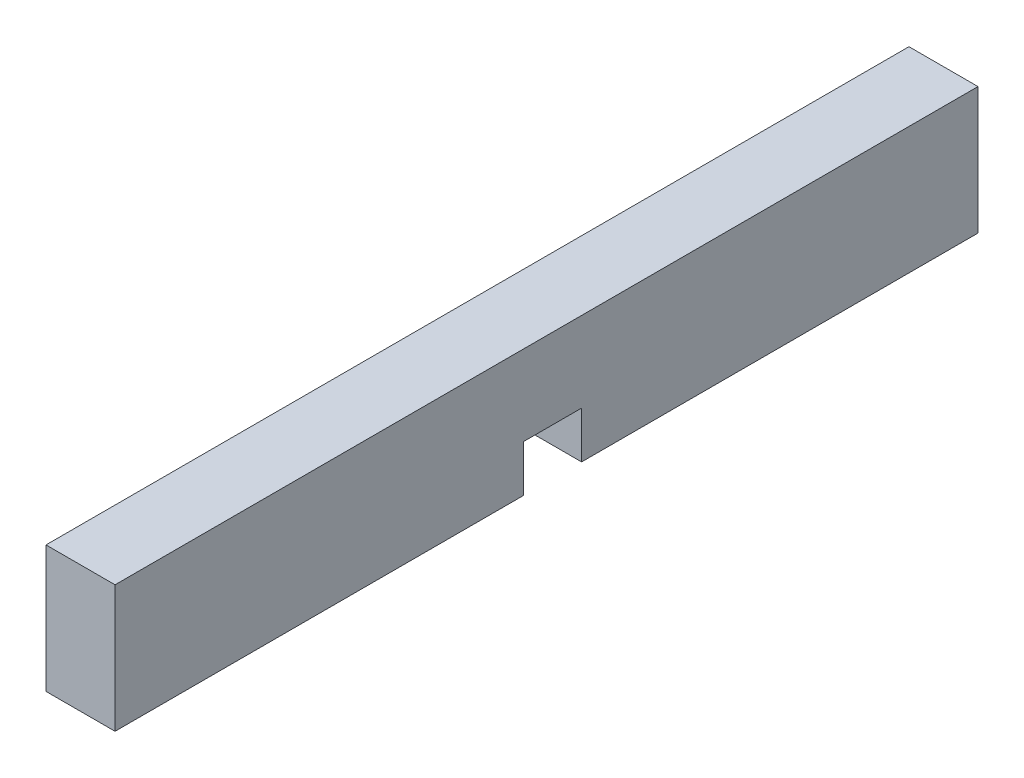
ISO-10303-21;
HEADER;
FILE_DESCRIPTION(('STEP AP214'),'2;1');
FILE_NAME('part.step','',(''),(''),'','','');
FILE_SCHEMA(('AUTOMOTIVE_DESIGN { 1 0 10303 214 1 1 1 1 }'));
ENDSEC;
DATA;
#1=APPLICATION_CONTEXT('core data for automotive mechanical design processes');
#2=APPLICATION_PROTOCOL_DEFINITION('international standard','automotive_design',2000,#1);
#3=PRODUCT_CONTEXT('',#1,'mechanical');
#4=PRODUCT('Part','Part','',(#3));
#5=PRODUCT_RELATED_PRODUCT_CATEGORY('part','',(#4));
#6=PRODUCT_DEFINITION_FORMATION('','',#4);
#7=PRODUCT_DEFINITION_CONTEXT('part definition',#1,'design');
#8=PRODUCT_DEFINITION('design','',#6,#7);
#9=PRODUCT_DEFINITION_SHAPE('','',#8);
#10=(LENGTH_UNIT() NAMED_UNIT(*) SI_UNIT(.MILLI.,.METRE.));
#11=(NAMED_UNIT(*) PLANE_ANGLE_UNIT() SI_UNIT($,.RADIAN.));
#12=(NAMED_UNIT(*) SI_UNIT($,.STERADIAN.) SOLID_ANGLE_UNIT());
#13=UNCERTAINTY_MEASURE_WITH_UNIT(LENGTH_MEASURE(1.E-05),#10,'distance_accuracy_value','');
#14=(GEOMETRIC_REPRESENTATION_CONTEXT(3) GLOBAL_UNCERTAINTY_ASSIGNED_CONTEXT((#13)) GLOBAL_UNIT_ASSIGNED_CONTEXT((#10,
#11,#12)) REPRESENTATION_CONTEXT('',''));
#15=CARTESIAN_POINT('',(0.,0.,0.));
#16=DIRECTION('',(0.,0.,1.));
#17=DIRECTION('',(1.,0.,0.));
#18=AXIS2_PLACEMENT_3D('',#15,#16,#17);
#19=CARTESIAN_POINT('',(2.3495,-4.318,29.3624));
#20=DIRECTION('',(0.,1.,0.));
#21=DIRECTION('',(0.,0.,1.));
#22=AXIS2_PLACEMENT_3D('',#19,#20,#21);
#23=PLANE('',#22);
#24=DIRECTION('',(0.,0.,-1.));
#25=VECTOR('',#24,1.);
#26=CARTESIAN_POINT('',(-2.3495,-4.318,29.3624));
#27=LINE('',#26,#25);
#28=CARTESIAN_POINT('',(-2.3495,-4.318,29.3624));
#29=VERTEX_POINT('',#28);
#30=CARTESIAN_POINT('',(-2.3495,-4.318,1.5748));
#31=VERTEX_POINT('',#30);
#32=EDGE_CURVE('E125',#29,#31,#27,.T.);
#33=ORIENTED_EDGE('',*,*,#32,.T.);
#34=DIRECTION('',(1.,0.,0.));
#35=VECTOR('',#34,1.);
#36=CARTESIAN_POINT('',(-2.3495,-4.318,1.5748));
#37=LINE('',#36,#35);
#38=CARTESIAN_POINT('',(2.3495,-4.318,1.5748));
#39=VERTEX_POINT('',#38);
#40=EDGE_CURVE('E108',#31,#39,#37,.T.);
#41=ORIENTED_EDGE('',*,*,#40,.T.);
#42=DIRECTION('',(0.,0.,-1.));
#43=VECTOR('',#42,1.);
#44=CARTESIAN_POINT('',(2.3495,-4.318,29.3624));
#45=LINE('',#44,#43);
#46=CARTESIAN_POINT('',(2.3495,-4.318,29.3624));
#47=VERTEX_POINT('',#46);
#48=EDGE_CURVE('E141',#47,#39,#45,.T.);
#49=ORIENTED_EDGE('',*,*,#48,.F.);
#50=DIRECTION('',(-1.,0.,0.));
#51=VECTOR('',#50,1.);
#52=CARTESIAN_POINT('',(2.3495,-4.318,29.3624));
#53=LINE('',#52,#51);
#54=EDGE_CURVE('E131',#47,#29,#53,.T.);
#55=ORIENTED_EDGE('',*,*,#54,.T.);
#56=EDGE_LOOP('',(#33,#41,#49,#55));
#57=FACE_BOUND('',#56,.T.);
#58=ADVANCED_FACE('F32',(#57),#23,.F.);
#59=CARTESIAN_POINT('',(2.3495,4.318,-29.3624));
#60=DIRECTION('',(0.,0.,1.));
#61=DIRECTION('',(1.,0.,0.));
#62=AXIS2_PLACEMENT_3D('',#59,#60,#61);
#63=PLANE('',#62);
#64=DIRECTION('',(0.,1.,0.));
#65=VECTOR('',#64,1.);
#66=CARTESIAN_POINT('',(-2.3495,4.318,-29.3624));
#67=LINE('',#66,#65);
#68=CARTESIAN_POINT('',(-2.3495,-4.318,-29.3624));
#69=VERTEX_POINT('',#68);
#70=CARTESIAN_POINT('',(-2.3495,4.318,-29.3624));
#71=VERTEX_POINT('',#70);
#72=EDGE_CURVE('E149',#69,#71,#67,.T.);
#73=ORIENTED_EDGE('',*,*,#72,.T.);
#74=DIRECTION('',(-1.,0.,0.));
#75=VECTOR('',#74,1.);
#76=CARTESIAN_POINT('',(2.3495,4.318,-29.3624));
#77=LINE('',#76,#75);
#78=CARTESIAN_POINT('',(2.3495,4.318,-29.3624));
#79=VERTEX_POINT('',#78);
#80=EDGE_CURVE('E11',#79,#71,#77,.T.);
#81=ORIENTED_EDGE('',*,*,#80,.F.);
#82=DIRECTION('',(0.,1.,0.));
#83=VECTOR('',#82,1.);
#84=CARTESIAN_POINT('',(2.3495,4.318,-29.3624));
#85=LINE('',#84,#83);
#86=CARTESIAN_POINT('',(2.3495,-4.318,-29.3624));
#87=VERTEX_POINT('',#86);
#88=EDGE_CURVE('E132',#87,#79,#85,.T.);
#89=ORIENTED_EDGE('',*,*,#88,.F.);
#90=DIRECTION('',(-1.,0.,0.));
#91=VECTOR('',#90,1.);
#92=CARTESIAN_POINT('',(2.3495,-4.318,-29.3624));
#93=LINE('',#92,#91);
#94=EDGE_CURVE('E139',#87,#69,#93,.T.);
#95=ORIENTED_EDGE('',*,*,#94,.T.);
#96=EDGE_LOOP('',(#73,#81,#89,#95));
#97=FACE_BOUND('',#96,.T.);
#98=ADVANCED_FACE('F34',(#97),#63,.F.);
#99=CARTESIAN_POINT('',(2.3495,4.318,29.3624));
#100=DIRECTION('',(0.,-1.,0.));
#101=DIRECTION('',(0.,0.,-1.));
#102=AXIS2_PLACEMENT_3D('',#99,#100,#101);
#103=PLANE('',#102);
#104=DIRECTION('',(0.,0.,1.));
#105=VECTOR('',#104,1.);
#106=CARTESIAN_POINT('',(-2.3495,4.318,29.3624));
#107=LINE('',#106,#105);
#108=CARTESIAN_POINT('',(-2.3495,4.318,29.3624));
#109=VERTEX_POINT('',#108);
#110=EDGE_CURVE('E148',#71,#109,#107,.T.);
#111=ORIENTED_EDGE('',*,*,#110,.T.);
#112=DIRECTION('',(-1.,0.,0.));
#113=VECTOR('',#112,1.);
#114=CARTESIAN_POINT('',(2.3495,4.318,29.3624));
#115=LINE('',#114,#113);
#116=CARTESIAN_POINT('',(2.3495,4.318,29.3624));
#117=VERTEX_POINT('',#116);
#118=EDGE_CURVE('E40',#117,#109,#115,.T.);
#119=ORIENTED_EDGE('',*,*,#118,.F.);
#120=DIRECTION('',(0.,0.,1.));
#121=VECTOR('',#120,1.);
#122=CARTESIAN_POINT('',(2.3495,4.318,29.3624));
#123=LINE('',#122,#121);
#124=EDGE_CURVE('E85',#79,#117,#123,.T.);
#125=ORIENTED_EDGE('',*,*,#124,.F.);
#126=ORIENTED_EDGE('',*,*,#80,.T.);
#127=EDGE_LOOP('',(#111,#119,#125,#126));
#128=FACE_BOUND('',#127,.T.);
#129=ADVANCED_FACE('F189',(#128),#103,.F.);
#130=CARTESIAN_POINT('',(2.3495,4.318,29.3624));
#131=DIRECTION('',(0.,0.,-1.));
#132=DIRECTION('',(-1.,0.,0.));
#133=AXIS2_PLACEMENT_3D('',#130,#131,#132);
#134=PLANE('',#133);
#135=DIRECTION('',(0.,-1.,0.));
#136=VECTOR('',#135,1.);
#137=CARTESIAN_POINT('',(-2.3495,4.318,29.3624));
#138=LINE('',#137,#136);
#139=EDGE_CURVE('E135',#109,#29,#138,.T.);
#140=ORIENTED_EDGE('',*,*,#139,.T.);
#141=ORIENTED_EDGE('',*,*,#54,.F.);
#142=DIRECTION('',(0.,-1.,0.));
#143=VECTOR('',#142,1.);
#144=CARTESIAN_POINT('',(2.3495,4.318,29.3624));
#145=LINE('',#144,#143);
#146=EDGE_CURVE('E146',#117,#47,#145,.T.);
#147=ORIENTED_EDGE('',*,*,#146,.F.);
#148=ORIENTED_EDGE('',*,*,#118,.T.);
#149=EDGE_LOOP('',(#140,#141,#147,#148));
#150=FACE_BOUND('',#149,.T.);
#151=ADVANCED_FACE('F145',(#150),#134,.F.);
#152=CARTESIAN_POINT('',(2.3495,-4.318,-2.3876));
#153=VERTEX_POINT('',#152);
#154=EDGE_CURVE('E56',#153,#87,#45,.T.);
#155=ORIENTED_EDGE('',*,*,#154,.F.);
#156=DIRECTION('',(1.,0.,0.));
#157=VECTOR('',#156,1.);
#158=CARTESIAN_POINT('',(-2.3495,-4.318,-2.3876));
#159=LINE('',#158,#157);
#160=CARTESIAN_POINT('',(-2.3495,-4.318,-2.3876));
#161=VERTEX_POINT('',#160);
#162=EDGE_CURVE('E119',#161,#153,#159,.T.);
#163=ORIENTED_EDGE('',*,*,#162,.F.);
#164=EDGE_CURVE('E78',#161,#69,#27,.T.);
#165=ORIENTED_EDGE('',*,*,#164,.T.);
#166=ORIENTED_EDGE('',*,*,#94,.F.);
#167=EDGE_LOOP('',(#155,#163,#165,#166));
#168=FACE_BOUND('',#167,.T.);
#169=ADVANCED_FACE('F169',(#168),#23,.F.);
#170=CARTESIAN_POINT('',(2.3495,0.,0.));
#171=DIRECTION('',(1.,0.,0.));
#172=DIRECTION('',(0.,0.,-1.));
#173=AXIS2_PLACEMENT_3D('',#170,#171,#172);
#174=PLANE('',#173);
#175=DIRECTION('',(0.,-1.,0.));
#176=VECTOR('',#175,1.);
#177=CARTESIAN_POINT('',(2.3495,0.,1.5748));
#178=LINE('',#177,#176);
#179=CARTESIAN_POINT('',(2.3495,-1.143,1.5748));
#180=VERTEX_POINT('',#179);
#181=EDGE_CURVE('E114',#180,#39,#178,.T.);
#182=ORIENTED_EDGE('',*,*,#181,.F.);
#183=DIRECTION('',(0.,0.,1.));
#184=VECTOR('',#183,1.);
#185=CARTESIAN_POINT('',(2.3495,-1.143,0.));
#186=LINE('',#185,#184);
#187=CARTESIAN_POINT('',(2.3495,-1.143,-2.3876));
#188=VERTEX_POINT('',#187);
#189=EDGE_CURVE('E157',#188,#180,#186,.T.);
#190=ORIENTED_EDGE('',*,*,#189,.F.);
#191=DIRECTION('',(0.,1.,0.));
#192=VECTOR('',#191,1.);
#193=CARTESIAN_POINT('',(2.3495,0.,-2.3876));
#194=LINE('',#193,#192);
#195=EDGE_CURVE('E159',#153,#188,#194,.T.);
#196=ORIENTED_EDGE('',*,*,#195,.F.);
#197=ORIENTED_EDGE('',*,*,#154,.T.);
#198=ORIENTED_EDGE('',*,*,#88,.T.);
#199=ORIENTED_EDGE('',*,*,#124,.T.);
#200=ORIENTED_EDGE('',*,*,#146,.T.);
#201=ORIENTED_EDGE('',*,*,#48,.T.);
#202=EDGE_LOOP('',(#182,#190,#196,#197,#198,#199,#200,#201));
#203=FACE_BOUND('',#202,.T.);
#204=ADVANCED_FACE('F173',(#203),#174,.T.);
#205=CARTESIAN_POINT('',(-2.3495,0.,0.));
#206=DIRECTION('',(1.,0.,0.));
#207=DIRECTION('',(0.,0.,-1.));
#208=AXIS2_PLACEMENT_3D('',#205,#206,#207);
#209=PLANE('',#208);
#210=DIRECTION('',(0.,0.,1.));
#211=VECTOR('',#210,1.);
#212=CARTESIAN_POINT('',(-2.3495,-1.143,1.5748));
#213=LINE('',#212,#211);
#214=CARTESIAN_POINT('',(-2.3495,-1.143,-2.3876));
#215=VERTEX_POINT('',#214);
#216=CARTESIAN_POINT('',(-2.3495,-1.143,1.5748));
#217=VERTEX_POINT('',#216);
#218=EDGE_CURVE('E47',#215,#217,#213,.T.);
#219=ORIENTED_EDGE('',*,*,#218,.T.);
#220=DIRECTION('',(0.,-1.,0.));
#221=VECTOR('',#220,1.);
#222=CARTESIAN_POINT('',(-2.3495,-4.318,1.5748));
#223=LINE('',#222,#221);
#224=EDGE_CURVE('E112',#217,#31,#223,.T.);
#225=ORIENTED_EDGE('',*,*,#224,.T.);
#226=ORIENTED_EDGE('',*,*,#32,.F.);
#227=ORIENTED_EDGE('',*,*,#139,.F.);
#228=ORIENTED_EDGE('',*,*,#110,.F.);
#229=ORIENTED_EDGE('',*,*,#72,.F.);
#230=ORIENTED_EDGE('',*,*,#164,.F.);
#231=DIRECTION('',(0.,1.,0.));
#232=VECTOR('',#231,1.);
#233=CARTESIAN_POINT('',(-2.3495,-4.318,-2.3876));
#234=LINE('',#233,#232);
#235=EDGE_CURVE('E127',#161,#215,#234,.T.);
#236=ORIENTED_EDGE('',*,*,#235,.T.);
#237=EDGE_LOOP('',(#219,#225,#226,#227,#228,#229,#230,#236));
#238=FACE_BOUND('',#237,.T.);
#239=ADVANCED_FACE('F123',(#238),#209,.F.);
#240=CARTESIAN_POINT('',(-2.3495,-4.318,1.5748));
#241=DIRECTION('',(0.,0.,1.));
#242=DIRECTION('',(1.,0.,0.));
#243=AXIS2_PLACEMENT_3D('',#240,#241,#242);
#244=PLANE('',#243);
#245=ORIENTED_EDGE('',*,*,#181,.T.);
#246=ORIENTED_EDGE('',*,*,#40,.F.);
#247=ORIENTED_EDGE('',*,*,#224,.F.);
#248=DIRECTION('',(1.,0.,0.));
#249=VECTOR('',#248,1.);
#250=CARTESIAN_POINT('',(-2.3495,-1.143,1.5748));
#251=LINE('',#250,#249);
#252=EDGE_CURVE('E160',#217,#180,#251,.T.);
#253=ORIENTED_EDGE('',*,*,#252,.T.);
#254=EDGE_LOOP('',(#245,#246,#247,#253));
#255=FACE_BOUND('',#254,.T.);
#256=ADVANCED_FACE('F110',(#255),#244,.F.);
#257=CARTESIAN_POINT('',(-2.3495,-1.143,1.5748));
#258=DIRECTION('',(0.,1.,0.));
#259=DIRECTION('',(0.,0.,1.));
#260=AXIS2_PLACEMENT_3D('',#257,#258,#259);
#261=PLANE('',#260);
#262=ORIENTED_EDGE('',*,*,#189,.T.);
#263=ORIENTED_EDGE('',*,*,#252,.F.);
#264=ORIENTED_EDGE('',*,*,#218,.F.);
#265=DIRECTION('',(1.,0.,0.));
#266=VECTOR('',#265,1.);
#267=CARTESIAN_POINT('',(-2.3495,-1.143,-2.3876));
#268=LINE('',#267,#266);
#269=EDGE_CURVE('E163',#215,#188,#268,.T.);
#270=ORIENTED_EDGE('',*,*,#269,.T.);
#271=EDGE_LOOP('',(#262,#263,#264,#270));
#272=FACE_BOUND('',#271,.T.);
#273=ADVANCED_FACE('F175',(#272),#261,.F.);
#274=CARTESIAN_POINT('',(-2.3495,-4.318,-2.3876));
#275=DIRECTION('',(0.,0.,-1.));
#276=DIRECTION('',(-1.,0.,0.));
#277=AXIS2_PLACEMENT_3D('',#274,#275,#276);
#278=PLANE('',#277);
#279=ORIENTED_EDGE('',*,*,#195,.T.);
#280=ORIENTED_EDGE('',*,*,#269,.F.);
#281=ORIENTED_EDGE('',*,*,#235,.F.);
#282=ORIENTED_EDGE('',*,*,#162,.T.);
#283=EDGE_LOOP('',(#279,#280,#281,#282));
#284=FACE_BOUND('',#283,.T.);
#285=ADVANCED_FACE('F168',(#284),#278,.F.);
#286=CLOSED_SHELL('',(#58,#98,#129,#151,#169,#204,#239,#256,#273,#285));
#287=MANIFOLD_SOLID_BREP('B2',#286);
#288=ADVANCED_BREP_SHAPE_REPRESENTATION('',(#18,#287),#14);
#289=SHAPE_DEFINITION_REPRESENTATION(#9,#288);
ENDSEC;
END-ISO-10303-21;
